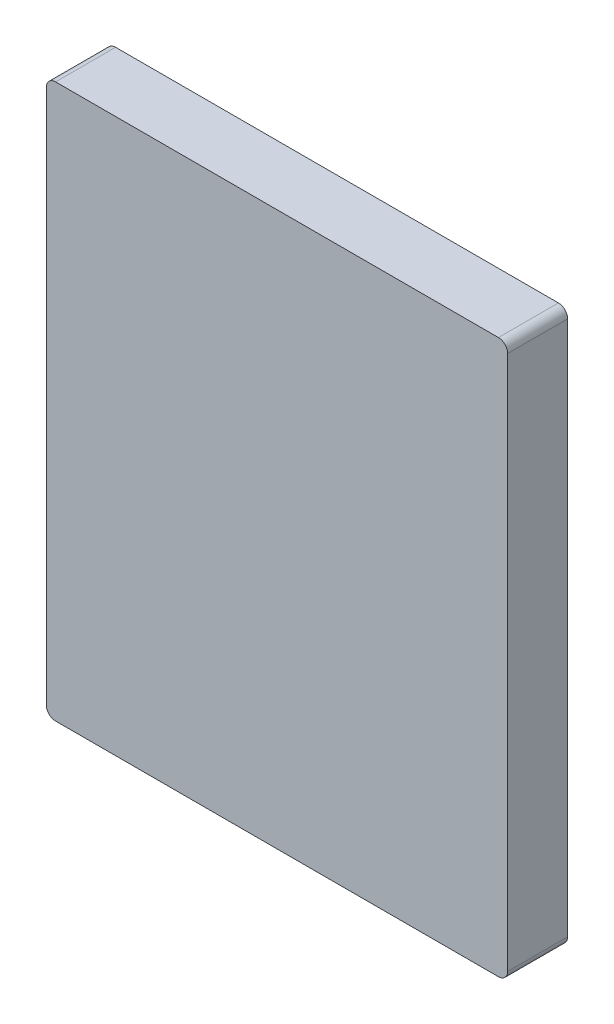
ISO-10303-21;
HEADER;
FILE_DESCRIPTION(('STEP AP214'),'2;1');
FILE_NAME('part.step','',(''),(''),'','','');
FILE_SCHEMA(('AUTOMOTIVE_DESIGN { 1 0 10303 214 1 1 1 1 }'));
ENDSEC;
DATA;
#1=APPLICATION_CONTEXT('core data for automotive mechanical design processes');
#2=APPLICATION_PROTOCOL_DEFINITION('international standard','automotive_design',2000,#1);
#3=PRODUCT_CONTEXT('',#1,'mechanical');
#4=PRODUCT('Part','Part','',(#3));
#5=PRODUCT_RELATED_PRODUCT_CATEGORY('part','',(#4));
#6=PRODUCT_DEFINITION_FORMATION('','',#4);
#7=PRODUCT_DEFINITION_CONTEXT('part definition',#1,'design');
#8=PRODUCT_DEFINITION('design','',#6,#7);
#9=PRODUCT_DEFINITION_SHAPE('','',#8);
#10=(LENGTH_UNIT() NAMED_UNIT(*) SI_UNIT(.MILLI.,.METRE.));
#11=(NAMED_UNIT(*) PLANE_ANGLE_UNIT() SI_UNIT($,.RADIAN.));
#12=(NAMED_UNIT(*) SI_UNIT($,.STERADIAN.) SOLID_ANGLE_UNIT());
#13=UNCERTAINTY_MEASURE_WITH_UNIT(LENGTH_MEASURE(1.E-05),#10,'distance_accuracy_value','');
#14=(GEOMETRIC_REPRESENTATION_CONTEXT(3) GLOBAL_UNCERTAINTY_ASSIGNED_CONTEXT((#13)) GLOBAL_UNIT_ASSIGNED_CONTEXT((#10,
#11,#12)) REPRESENTATION_CONTEXT('',''));
#15=CARTESIAN_POINT('',(0.,0.,0.));
#16=DIRECTION('',(0.,0.,1.));
#17=DIRECTION('',(1.,0.,0.));
#18=AXIS2_PLACEMENT_3D('',#15,#16,#17);
#19=CARTESIAN_POINT('',(5.,-6.,1.3));
#20=DIRECTION('',(-1.,0.,0.));
#21=DIRECTION('',(0.,0.,1.));
#22=AXIS2_PLACEMENT_3D('',#19,#20,#21);
#23=PLANE('',#22);
#24=DIRECTION('',(0.,1.,0.));
#25=VECTOR('',#24,1.);
#26=CARTESIAN_POINT('',(5.,-6.,1.3));
#27=LINE('',#26,#25);
#28=CARTESIAN_POINT('',(5.,-5.8,1.3));
#29=VERTEX_POINT('',#28);
#30=CARTESIAN_POINT('',(5.,5.8,1.3));
#31=VERTEX_POINT('',#30);
#32=EDGE_CURVE('E124',#29,#31,#27,.T.);
#33=ORIENTED_EDGE('',*,*,#32,.F.);
#34=DIRECTION('',(0.,0.,-1.));
#35=VECTOR('',#34,1.);
#36=CARTESIAN_POINT('',(5.,-5.8,1.3));
#37=LINE('',#36,#35);
#38=CARTESIAN_POINT('',(5.,-5.8,0.));
#39=VERTEX_POINT('',#38);
#40=EDGE_CURVE('E150',#29,#39,#37,.T.);
#41=ORIENTED_EDGE('',*,*,#40,.T.);
#42=DIRECTION('',(0.,1.,0.));
#43=VECTOR('',#42,1.);
#44=CARTESIAN_POINT('',(5.,-6.,0.));
#45=LINE('',#44,#43);
#46=CARTESIAN_POINT('',(5.,5.8,0.));
#47=VERTEX_POINT('',#46);
#48=EDGE_CURVE('E158',#39,#47,#45,.T.);
#49=ORIENTED_EDGE('',*,*,#48,.T.);
#50=DIRECTION('',(0.,0.,-1.));
#51=VECTOR('',#50,1.);
#52=CARTESIAN_POINT('',(5.,5.8,1.3));
#53=LINE('',#52,#51);
#54=EDGE_CURVE('E148',#47,#31,#53,.F.);
#55=ORIENTED_EDGE('',*,*,#54,.T.);
#56=EDGE_LOOP('',(#33,#41,#49,#55));
#57=FACE_BOUND('',#56,.T.);
#58=ADVANCED_FACE('F33',(#57),#23,.F.);
#59=CARTESIAN_POINT('',(-5.,6.,1.3));
#60=DIRECTION('',(0.,-1.,0.));
#61=DIRECTION('',(0.,0.,-1.));
#62=AXIS2_PLACEMENT_3D('',#59,#60,#61);
#63=PLANE('',#62);
#64=DIRECTION('',(-1.,0.,0.));
#65=VECTOR('',#64,1.);
#66=CARTESIAN_POINT('',(-5.,6.,0.));
#67=LINE('',#66,#65);
#68=CARTESIAN_POINT('',(4.8,6.,0.));
#69=VERTEX_POINT('',#68);
#70=CARTESIAN_POINT('',(-4.8,6.,0.));
#71=VERTEX_POINT('',#70);
#72=EDGE_CURVE('E129',#69,#71,#67,.T.);
#73=ORIENTED_EDGE('',*,*,#72,.T.);
#74=DIRECTION('',(0.,0.,-1.));
#75=VECTOR('',#74,1.);
#76=CARTESIAN_POINT('',(-4.8,6.,1.3));
#77=LINE('',#76,#75);
#78=CARTESIAN_POINT('',(-4.8,6.,1.3));
#79=VERTEX_POINT('',#78);
#80=EDGE_CURVE('E11',#71,#79,#77,.F.);
#81=ORIENTED_EDGE('',*,*,#80,.T.);
#82=DIRECTION('',(-1.,0.,0.));
#83=VECTOR('',#82,1.);
#84=CARTESIAN_POINT('',(-5.,6.,1.3));
#85=LINE('',#84,#83);
#86=CARTESIAN_POINT('',(4.8,6.,1.3));
#87=VERTEX_POINT('',#86);
#88=EDGE_CURVE('E127',#87,#79,#85,.T.);
#89=ORIENTED_EDGE('',*,*,#88,.F.);
#90=DIRECTION('',(0.,0.,-1.));
#91=VECTOR('',#90,1.);
#92=CARTESIAN_POINT('',(4.8,6.,1.3));
#93=LINE('',#92,#91);
#94=EDGE_CURVE('E41',#87,#69,#93,.T.);
#95=ORIENTED_EDGE('',*,*,#94,.T.);
#96=EDGE_LOOP('',(#73,#81,#89,#95));
#97=FACE_BOUND('',#96,.T.);
#98=ADVANCED_FACE('F155',(#97),#63,.F.);
#99=CARTESIAN_POINT('',(-5.,-6.,1.3));
#100=DIRECTION('',(1.,0.,0.));
#101=DIRECTION('',(0.,0.,-1.));
#102=AXIS2_PLACEMENT_3D('',#99,#100,#101);
#103=PLANE('',#102);
#104=DIRECTION('',(0.,-1.,0.));
#105=VECTOR('',#104,1.);
#106=CARTESIAN_POINT('',(-5.,-6.,0.));
#107=LINE('',#106,#105);
#108=CARTESIAN_POINT('',(-5.,5.8,0.));
#109=VERTEX_POINT('',#108);
#110=CARTESIAN_POINT('',(-5.,-5.8,0.));
#111=VERTEX_POINT('',#110);
#112=EDGE_CURVE('E125',#109,#111,#107,.T.);
#113=ORIENTED_EDGE('',*,*,#112,.T.);
#114=DIRECTION('',(0.,0.,-1.));
#115=VECTOR('',#114,1.);
#116=CARTESIAN_POINT('',(-5.,-5.8,1.3));
#117=LINE('',#116,#115);
#118=CARTESIAN_POINT('',(-5.,-5.8,1.3));
#119=VERTEX_POINT('',#118);
#120=EDGE_CURVE('E103',#111,#119,#117,.F.);
#121=ORIENTED_EDGE('',*,*,#120,.T.);
#122=DIRECTION('',(0.,-1.,0.));
#123=VECTOR('',#122,1.);
#124=CARTESIAN_POINT('',(-5.,-6.,1.3));
#125=LINE('',#124,#123);
#126=CARTESIAN_POINT('',(-5.,5.8,1.3));
#127=VERTEX_POINT('',#126);
#128=EDGE_CURVE('E162',#127,#119,#125,.T.);
#129=ORIENTED_EDGE('',*,*,#128,.F.);
#130=DIRECTION('',(0.,0.,-1.));
#131=VECTOR('',#130,1.);
#132=CARTESIAN_POINT('',(-5.,5.8,1.3));
#133=LINE('',#132,#131);
#134=EDGE_CURVE('E108',#127,#109,#133,.T.);
#135=ORIENTED_EDGE('',*,*,#134,.T.);
#136=EDGE_LOOP('',(#113,#121,#129,#135));
#137=FACE_BOUND('',#136,.T.);
#138=ADVANCED_FACE('F172',(#137),#103,.F.);
#139=CARTESIAN_POINT('',(-5.,-6.,1.3));
#140=DIRECTION('',(0.,1.,0.));
#141=DIRECTION('',(0.,0.,1.));
#142=AXIS2_PLACEMENT_3D('',#139,#140,#141);
#143=PLANE('',#142);
#144=DIRECTION('',(1.,0.,0.));
#145=VECTOR('',#144,1.);
#146=CARTESIAN_POINT('',(-5.,-6.,1.3));
#147=LINE('',#146,#145);
#148=CARTESIAN_POINT('',(-4.8,-6.,1.3));
#149=VERTEX_POINT('',#148);
#150=CARTESIAN_POINT('',(4.8,-6.,1.3));
#151=VERTEX_POINT('',#150);
#152=EDGE_CURVE('E118',#149,#151,#147,.T.);
#153=ORIENTED_EDGE('',*,*,#152,.F.);
#154=DIRECTION('',(0.,0.,-1.));
#155=VECTOR('',#154,1.);
#156=CARTESIAN_POINT('',(-4.8,-6.,1.3));
#157=LINE('',#156,#155);
#158=CARTESIAN_POINT('',(-4.8,-6.,0.));
#159=VERTEX_POINT('',#158);
#160=EDGE_CURVE('E102',#149,#159,#157,.T.);
#161=ORIENTED_EDGE('',*,*,#160,.T.);
#162=DIRECTION('',(1.,0.,0.));
#163=VECTOR('',#162,1.);
#164=CARTESIAN_POINT('',(-5.,-6.,0.));
#165=LINE('',#164,#163);
#166=CARTESIAN_POINT('',(4.8,-6.,0.));
#167=VERTEX_POINT('',#166);
#168=EDGE_CURVE('E115',#159,#167,#165,.T.);
#169=ORIENTED_EDGE('',*,*,#168,.T.);
#170=DIRECTION('',(0.,0.,-1.));
#171=VECTOR('',#170,1.);
#172=CARTESIAN_POINT('',(4.8,-6.,1.3));
#173=LINE('',#172,#171);
#174=EDGE_CURVE('E120',#167,#151,#173,.F.);
#175=ORIENTED_EDGE('',*,*,#174,.T.);
#176=EDGE_LOOP('',(#153,#161,#169,#175));
#177=FACE_BOUND('',#176,.T.);
#178=ADVANCED_FACE('F114',(#177),#143,.F.);
#179=CARTESIAN_POINT('',(0.,0.,1.3));
#180=DIRECTION('',(0.,0.,-1.));
#181=DIRECTION('',(-1.,0.,0.));
#182=AXIS2_PLACEMENT_3D('',#179,#180,#181);
#183=PLANE('',#182);
#184=ORIENTED_EDGE('',*,*,#128,.T.);
#185=CARTESIAN_POINT('',(-4.8,-5.8,1.3));
#186=DIRECTION('',(0.,0.,-1.));
#187=DIRECTION('',(-1.,0.,0.));
#188=AXIS2_PLACEMENT_3D('',#185,#186,#187);
#189=CIRCLE('',#188,0.2);
#190=EDGE_CURVE('E146',#119,#149,#189,.F.);
#191=ORIENTED_EDGE('',*,*,#190,.T.);
#192=ORIENTED_EDGE('',*,*,#152,.T.);
#193=CARTESIAN_POINT('',(4.8,-5.8,1.3));
#194=DIRECTION('',(0.,0.,-1.));
#195=DIRECTION('',(-1.,0.,0.));
#196=AXIS2_PLACEMENT_3D('',#193,#194,#195);
#197=CIRCLE('',#196,0.2);
#198=EDGE_CURVE('E144',#151,#29,#197,.F.);
#199=ORIENTED_EDGE('',*,*,#198,.T.);
#200=ORIENTED_EDGE('',*,*,#32,.T.);
#201=CARTESIAN_POINT('',(4.8,5.8,1.3));
#202=DIRECTION('',(0.,0.,-1.));
#203=DIRECTION('',(-1.,0.,0.));
#204=AXIS2_PLACEMENT_3D('',#201,#202,#203);
#205=CIRCLE('',#204,0.2);
#206=EDGE_CURVE('E53',#31,#87,#205,.F.);
#207=ORIENTED_EDGE('',*,*,#206,.T.);
#208=ORIENTED_EDGE('',*,*,#88,.T.);
#209=CARTESIAN_POINT('',(-4.8,5.8,1.3));
#210=DIRECTION('',(0.,0.,-1.));
#211=DIRECTION('',(-1.,0.,0.));
#212=AXIS2_PLACEMENT_3D('',#209,#210,#211);
#213=CIRCLE('',#212,0.2);
#214=EDGE_CURVE('E142',#79,#127,#213,.F.);
#215=ORIENTED_EDGE('',*,*,#214,.T.);
#216=EDGE_LOOP('',(#184,#191,#192,#199,#200,#207,#208,#215));
#217=FACE_BOUND('',#216,.T.);
#218=ADVANCED_FACE('F166',(#217),#183,.F.);
#219=CARTESIAN_POINT('',(0.,0.,0.));
#220=DIRECTION('',(0.,0.,-1.));
#221=DIRECTION('',(-1.,0.,0.));
#222=AXIS2_PLACEMENT_3D('',#219,#220,#221);
#223=PLANE('',#222);
#224=ORIENTED_EDGE('',*,*,#168,.F.);
#225=CARTESIAN_POINT('',(-4.8,-5.8,0.));
#226=DIRECTION('',(0.,0.,-1.));
#227=DIRECTION('',(-1.,0.,0.));
#228=AXIS2_PLACEMENT_3D('',#225,#226,#227);
#229=CIRCLE('',#228,0.2);
#230=EDGE_CURVE('E98',#159,#111,#229,.T.);
#231=ORIENTED_EDGE('',*,*,#230,.T.);
#232=ORIENTED_EDGE('',*,*,#112,.F.);
#233=CARTESIAN_POINT('',(-4.8,5.8,0.));
#234=DIRECTION('',(0.,0.,-1.));
#235=DIRECTION('',(-1.,0.,0.));
#236=AXIS2_PLACEMENT_3D('',#233,#234,#235);
#237=CIRCLE('',#236,0.2);
#238=EDGE_CURVE('E135',#109,#71,#237,.T.);
#239=ORIENTED_EDGE('',*,*,#238,.T.);
#240=ORIENTED_EDGE('',*,*,#72,.F.);
#241=CARTESIAN_POINT('',(4.8,5.8,0.));
#242=DIRECTION('',(0.,0.,-1.));
#243=DIRECTION('',(-1.,0.,0.));
#244=AXIS2_PLACEMENT_3D('',#241,#242,#243);
#245=CIRCLE('',#244,0.2);
#246=EDGE_CURVE('E119',#69,#47,#245,.T.);
#247=ORIENTED_EDGE('',*,*,#246,.T.);
#248=ORIENTED_EDGE('',*,*,#48,.F.);
#249=CARTESIAN_POINT('',(4.8,-5.8,0.));
#250=DIRECTION('',(0.,0.,-1.));
#251=DIRECTION('',(-1.,0.,0.));
#252=AXIS2_PLACEMENT_3D('',#249,#250,#251);
#253=CIRCLE('',#252,0.2);
#254=EDGE_CURVE('E109',#39,#167,#253,.T.);
#255=ORIENTED_EDGE('',*,*,#254,.T.);
#256=EDGE_LOOP('',(#224,#231,#232,#239,#240,#247,#248,#255));
#257=FACE_BOUND('',#256,.T.);
#258=ADVANCED_FACE('F122',(#257),#223,.T.);
#259=CARTESIAN_POINT('',(-4.8,-5.8,1.3));
#260=DIRECTION('',(0.,0.,-1.));
#261=DIRECTION('',(-1.,0.,0.));
#262=AXIS2_PLACEMENT_3D('',#259,#260,#261);
#263=CYLINDRICAL_SURFACE('',#262,0.2);
#264=ORIENTED_EDGE('',*,*,#190,.F.);
#265=ORIENTED_EDGE('',*,*,#120,.F.);
#266=ORIENTED_EDGE('',*,*,#230,.F.);
#267=ORIENTED_EDGE('',*,*,#160,.F.);
#268=EDGE_LOOP('',(#264,#265,#266,#267));
#269=FACE_BOUND('',#268,.T.);
#270=ADVANCED_FACE('F101',(#269),#263,.T.);
#271=CARTESIAN_POINT('',(4.8,-5.8,1.3));
#272=DIRECTION('',(0.,0.,-1.));
#273=DIRECTION('',(-1.,0.,0.));
#274=AXIS2_PLACEMENT_3D('',#271,#272,#273);
#275=CYLINDRICAL_SURFACE('',#274,0.2);
#276=ORIENTED_EDGE('',*,*,#198,.F.);
#277=ORIENTED_EDGE('',*,*,#174,.F.);
#278=ORIENTED_EDGE('',*,*,#254,.F.);
#279=ORIENTED_EDGE('',*,*,#40,.F.);
#280=EDGE_LOOP('',(#276,#277,#278,#279));
#281=FACE_BOUND('',#280,.T.);
#282=ADVANCED_FACE('F177',(#281),#275,.T.);
#283=CARTESIAN_POINT('',(-4.8,5.8,1.3));
#284=DIRECTION('',(0.,0.,-1.));
#285=DIRECTION('',(-1.,0.,0.));
#286=AXIS2_PLACEMENT_3D('',#283,#284,#285);
#287=CYLINDRICAL_SURFACE('',#286,0.2);
#288=ORIENTED_EDGE('',*,*,#214,.F.);
#289=ORIENTED_EDGE('',*,*,#80,.F.);
#290=ORIENTED_EDGE('',*,*,#238,.F.);
#291=ORIENTED_EDGE('',*,*,#134,.F.);
#292=EDGE_LOOP('',(#288,#289,#290,#291));
#293=FACE_BOUND('',#292,.T.);
#294=ADVANCED_FACE('F170',(#293),#287,.T.);
#295=CARTESIAN_POINT('',(4.8,5.8,1.3));
#296=DIRECTION('',(0.,0.,-1.));
#297=DIRECTION('',(-1.,0.,0.));
#298=AXIS2_PLACEMENT_3D('',#295,#296,#297);
#299=CYLINDRICAL_SURFACE('',#298,0.2);
#300=ORIENTED_EDGE('',*,*,#206,.F.);
#301=ORIENTED_EDGE('',*,*,#54,.F.);
#302=ORIENTED_EDGE('',*,*,#246,.F.);
#303=ORIENTED_EDGE('',*,*,#94,.F.);
#304=EDGE_LOOP('',(#300,#301,#302,#303));
#305=FACE_BOUND('',#304,.T.);
#306=ADVANCED_FACE('F35',(#305),#299,.T.);
#307=CLOSED_SHELL('',(#58,#98,#138,#178,#218,#258,#270,#282,#294,#306));
#308=MANIFOLD_SOLID_BREP('B2',#307);
#309=ADVANCED_BREP_SHAPE_REPRESENTATION('',(#18,#308),#14);
#310=SHAPE_DEFINITION_REPRESENTATION(#9,#309);
ENDSEC;
END-ISO-10303-21;
